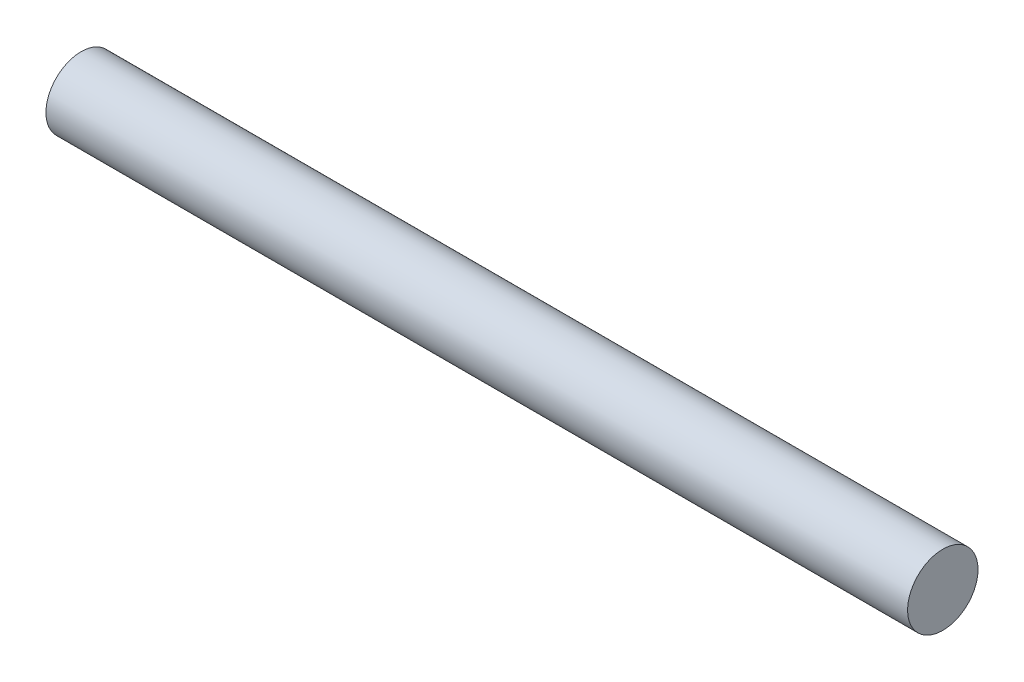
ISO-10303-21;
HEADER;
FILE_DESCRIPTION(('STEP AP214'),'2;1');
FILE_NAME('part.step','',(''),(''),'','','');
FILE_SCHEMA(('AUTOMOTIVE_DESIGN { 1 0 10303 214 1 1 1 1 }'));
ENDSEC;
DATA;
#1=APPLICATION_CONTEXT('core data for automotive mechanical design processes');
#2=APPLICATION_PROTOCOL_DEFINITION('international standard','automotive_design',2000,#1);
#3=PRODUCT_CONTEXT('',#1,'mechanical');
#4=PRODUCT('Part','Part','',(#3));
#5=PRODUCT_RELATED_PRODUCT_CATEGORY('part','',(#4));
#6=PRODUCT_DEFINITION_FORMATION('','',#4);
#7=PRODUCT_DEFINITION_CONTEXT('part definition',#1,'design');
#8=PRODUCT_DEFINITION('design','',#6,#7);
#9=PRODUCT_DEFINITION_SHAPE('','',#8);
#10=(LENGTH_UNIT() NAMED_UNIT(*) SI_UNIT(.MILLI.,.METRE.));
#11=(NAMED_UNIT(*) PLANE_ANGLE_UNIT() SI_UNIT($,.RADIAN.));
#12=(NAMED_UNIT(*) SI_UNIT($,.STERADIAN.) SOLID_ANGLE_UNIT());
#13=UNCERTAINTY_MEASURE_WITH_UNIT(LENGTH_MEASURE(1.E-05),#10,'distance_accuracy_value','');
#14=(GEOMETRIC_REPRESENTATION_CONTEXT(3) GLOBAL_UNCERTAINTY_ASSIGNED_CONTEXT((#13)) GLOBAL_UNIT_ASSIGNED_CONTEXT((#10,
#11,#12)) REPRESENTATION_CONTEXT('',''));
#15=CARTESIAN_POINT('',(0.,0.,0.));
#16=DIRECTION('',(0.,0.,1.));
#17=DIRECTION('',(1.,0.,0.));
#18=AXIS2_PLACEMENT_3D('',#15,#16,#17);
#19=CARTESIAN_POINT('',(60.,0.,0.));
#20=DIRECTION('',(-1.,0.,0.));
#21=DIRECTION('',(0.,0.,1.));
#22=AXIS2_PLACEMENT_3D('',#19,#20,#21);
#23=CYLINDRICAL_SURFACE('',#22,2.45);
#24=CARTESIAN_POINT('',(60.,0.,0.));
#25=DIRECTION('',(1.,0.,0.));
#26=DIRECTION('',(0.,0.,-1.));
#27=AXIS2_PLACEMENT_3D('',#24,#25,#26);
#28=CIRCLE('',#27,2.45);
#29=CARTESIAN_POINT('',(60.,0.,-2.45));
#30=VERTEX_POINT('',#29);
#31=EDGE_CURVE('E10',#30,#30,#28,.T.);
#32=ORIENTED_EDGE('',*,*,#31,.F.);
#33=EDGE_LOOP('',(#32));
#34=FACE_BOUND('',#33,.T.);
#35=CARTESIAN_POINT('',(0.,0.,0.));
#36=DIRECTION('',(1.,0.,0.));
#37=DIRECTION('',(0.,0.,-1.));
#38=AXIS2_PLACEMENT_3D('',#35,#36,#37);
#39=CIRCLE('',#38,2.45);
#40=CARTESIAN_POINT('',(0.,0.,-2.45));
#41=VERTEX_POINT('',#40);
#42=EDGE_CURVE('E42',#41,#41,#39,.T.);
#43=ORIENTED_EDGE('',*,*,#42,.T.);
#44=EDGE_LOOP('',(#43));
#45=FACE_BOUND('',#44,.T.);
#46=ADVANCED_FACE('F39',(#34,#45),#23,.T.);
#47=CARTESIAN_POINT('',(60.,0.,0.));
#48=DIRECTION('',(1.,0.,0.));
#49=DIRECTION('',(0.,0.,-1.));
#50=AXIS2_PLACEMENT_3D('',#47,#48,#49);
#51=PLANE('',#50);
#52=ORIENTED_EDGE('',*,*,#31,.T.);
#53=EDGE_LOOP('',(#52));
#54=FACE_BOUND('',#53,.T.);
#55=ADVANCED_FACE('F56',(#54),#51,.T.);
#56=CARTESIAN_POINT('',(0.,0.,0.));
#57=DIRECTION('',(1.,0.,0.));
#58=DIRECTION('',(0.,0.,-1.));
#59=AXIS2_PLACEMENT_3D('',#56,#57,#58);
#60=PLANE('',#59);
#61=ORIENTED_EDGE('',*,*,#42,.F.);
#62=EDGE_LOOP('',(#61));
#63=FACE_BOUND('',#62,.T.);
#64=ADVANCED_FACE('F54',(#63),#60,.F.);
#65=CLOSED_SHELL('',(#46,#55,#64));
#66=MANIFOLD_SOLID_BREP('B2',#65);
#67=ADVANCED_BREP_SHAPE_REPRESENTATION('',(#18,#66),#14);
#68=SHAPE_DEFINITION_REPRESENTATION(#9,#67);
ENDSEC;
END-ISO-10303-21;
